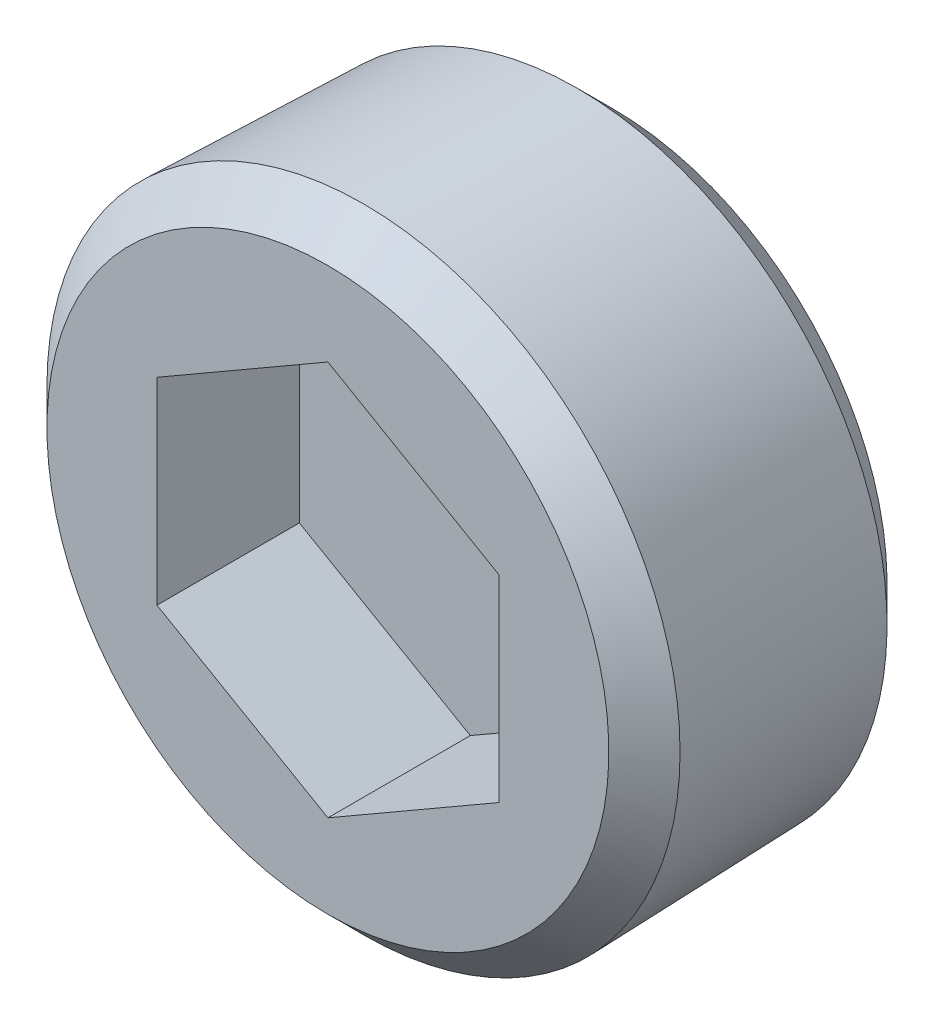
ISO-10303-21;
HEADER;
FILE_DESCRIPTION(('STEP AP214'),'2;1');
FILE_NAME('part.step','',(''),(''),'','','');
FILE_SCHEMA(('AUTOMOTIVE_DESIGN { 1 0 10303 214 1 1 1 1 }'));
ENDSEC;
DATA;
#1=APPLICATION_CONTEXT('core data for automotive mechanical design processes');
#2=APPLICATION_PROTOCOL_DEFINITION('international standard','automotive_design',2000,#1);
#3=PRODUCT_CONTEXT('',#1,'mechanical');
#4=PRODUCT('Part','Part','',(#3));
#5=PRODUCT_RELATED_PRODUCT_CATEGORY('part','',(#4));
#6=PRODUCT_DEFINITION_FORMATION('','',#4);
#7=PRODUCT_DEFINITION_CONTEXT('part definition',#1,'design');
#8=PRODUCT_DEFINITION('design','',#6,#7);
#9=PRODUCT_DEFINITION_SHAPE('','',#8);
#10=(LENGTH_UNIT() NAMED_UNIT(*) SI_UNIT(.MILLI.,.METRE.));
#11=(NAMED_UNIT(*) PLANE_ANGLE_UNIT() SI_UNIT($,.RADIAN.));
#12=(NAMED_UNIT(*) SI_UNIT($,.STERADIAN.) SOLID_ANGLE_UNIT());
#13=UNCERTAINTY_MEASURE_WITH_UNIT(LENGTH_MEASURE(1.E-05),#10,'distance_accuracy_value','');
#14=(GEOMETRIC_REPRESENTATION_CONTEXT(3) GLOBAL_UNCERTAINTY_ASSIGNED_CONTEXT((#13)) GLOBAL_UNIT_ASSIGNED_CONTEXT((#10,
#11,#12)) REPRESENTATION_CONTEXT('',''));
#15=CARTESIAN_POINT('',(0.,0.,0.));
#16=DIRECTION('',(0.,0.,1.));
#17=DIRECTION('',(1.,0.,0.));
#18=AXIS2_PLACEMENT_3D('',#15,#16,#17);
#19=CARTESIAN_POINT('',(0.,0.,0.));
#20=DIRECTION('',(0.,0.,-1.));
#21=DIRECTION('',(0.,1.,0.));
#22=AXIS2_PLACEMENT_3D('',#19,#20,#21);
#23=PLANE('',#22);
#24=CARTESIAN_POINT('',(0.,0.,0.));
#25=DIRECTION('',(0.,0.,-1.));
#26=DIRECTION('',(0.,1.,0.));
#27=AXIS2_PLACEMENT_3D('',#24,#25,#26);
#28=CIRCLE('',#27,11.5540504104122);
#29=CARTESIAN_POINT('',(0.,11.5540504104122,0.));
#30=VERTEX_POINT('',#29);
#31=EDGE_CURVE('E11',#30,#30,#28,.T.);
#32=ORIENTED_EDGE('',*,*,#31,.T.);
#33=EDGE_LOOP('',(#32));
#34=FACE_BOUND('',#33,.T.);
#35=ADVANCED_FACE('F41',(#34),#23,.T.);
#36=CARTESIAN_POINT('',(0.,0.,0.));
#37=DIRECTION('',(0.,0.,1.));
#38=DIRECTION('',(0.,-1.,0.));
#39=AXIS2_PLACEMENT_3D('',#36,#37,#38);
#40=CONICAL_SURFACE('',#39,11.5540504104122,0.785398163397446);
#41=CARTESIAN_POINT('',(0.,0.,1.5));
#42=DIRECTION('',(0.,0.,-1.));
#43=DIRECTION('',(0.,1.,0.));
#44=AXIS2_PLACEMENT_3D('',#41,#42,#43);
#45=CIRCLE('',#44,13.0540504104122);
#46=CARTESIAN_POINT('',(0.,13.0540504104122,1.5));
#47=VERTEX_POINT('',#46);
#48=EDGE_CURVE('E48',#47,#47,#45,.T.);
#49=ORIENTED_EDGE('',*,*,#48,.T.);
#50=EDGE_LOOP('',(#49));
#51=FACE_BOUND('',#50,.T.);
#52=ORIENTED_EDGE('',*,*,#31,.F.);
#53=EDGE_LOOP('',(#52));
#54=FACE_BOUND('',#53,.T.);
#55=ADVANCED_FACE('F155',(#51,#54),#40,.T.);
#56=CARTESIAN_POINT('',(0.,0.,1.5));
#57=DIRECTION('',(0.,0.,1.));
#58=DIRECTION('',(0.,-1.,0.));
#59=AXIS2_PLACEMENT_3D('',#56,#57,#58);
#60=CONICAL_SURFACE('',#59,13.0540504104122,0.0312064870256583);
#61=CARTESIAN_POINT('',(0.,0.,10.5));
#62=DIRECTION('',(0.,0.,-1.));
#63=DIRECTION('',(0.,1.,0.));
#64=AXIS2_PLACEMENT_3D('',#61,#62,#63);
#65=CIRCLE('',#64,13.335);
#66=CARTESIAN_POINT('',(0.,13.335,10.5));
#67=VERTEX_POINT('',#66);
#68=EDGE_CURVE('E150',#67,#67,#65,.T.);
#69=ORIENTED_EDGE('',*,*,#68,.T.);
#70=EDGE_LOOP('',(#69));
#71=FACE_BOUND('',#70,.T.);
#72=ORIENTED_EDGE('',*,*,#48,.F.);
#73=EDGE_LOOP('',(#72));
#74=FACE_BOUND('',#73,.T.);
#75=ADVANCED_FACE('F158',(#71,#74),#60,.T.);
#76=CARTESIAN_POINT('',(0.,0.,10.5));
#77=DIRECTION('',(0.,0.,-1.));
#78=DIRECTION('',(0.,1.,0.));
#79=AXIS2_PLACEMENT_3D('',#76,#77,#78);
#80=CONICAL_SURFACE('',#79,13.335,0.785398163397447);
#81=CARTESIAN_POINT('',(0.,0.,12.));
#82=DIRECTION('',(0.,0.,-1.));
#83=DIRECTION('',(0.,1.,0.));
#84=AXIS2_PLACEMENT_3D('',#81,#82,#83);
#85=CIRCLE('',#84,11.835);
#86=CARTESIAN_POINT('',(0.,11.835,12.));
#87=VERTEX_POINT('',#86);
#88=EDGE_CURVE('E142',#87,#87,#85,.T.);
#89=ORIENTED_EDGE('',*,*,#88,.T.);
#90=EDGE_LOOP('',(#89));
#91=FACE_BOUND('',#90,.T.);
#92=ORIENTED_EDGE('',*,*,#68,.F.);
#93=EDGE_LOOP('',(#92));
#94=FACE_BOUND('',#93,.T.);
#95=ADVANCED_FACE('F160',(#91,#94),#80,.T.);
#96=CARTESIAN_POINT('',(0.,11.835,12.));
#97=DIRECTION('',(0.,0.,1.));
#98=DIRECTION('',(0.,-1.,0.));
#99=AXIS2_PLACEMENT_3D('',#96,#97,#98);
#100=PLANE('',#99);
#101=DIRECTION('',(0.866025403784439,-0.5,0.));
#102=VECTOR('',#101,1.);
#103=CARTESIAN_POINT('',(-7.2,-4.15692193816531,12.));
#104=LINE('',#103,#102);
#105=CARTESIAN_POINT('',(-7.2,-4.15692193816531,12.));
#106=VERTEX_POINT('',#105);
#107=CARTESIAN_POINT('',(0.,-8.31384387633061,12.));
#108=VERTEX_POINT('',#107);
#109=EDGE_CURVE('E55',#106,#108,#104,.T.);
#110=ORIENTED_EDGE('',*,*,#109,.F.);
#111=DIRECTION('',(0.,-1.,0.));
#112=VECTOR('',#111,1.);
#113=CARTESIAN_POINT('',(-7.2,4.15692193816531,12.));
#114=LINE('',#113,#112);
#115=CARTESIAN_POINT('',(-7.2,4.15692193816531,12.));
#116=VERTEX_POINT('',#115);
#117=EDGE_CURVE('E138',#116,#106,#114,.T.);
#118=ORIENTED_EDGE('',*,*,#117,.F.);
#119=DIRECTION('',(-0.866025403784439,-0.5,0.));
#120=VECTOR('',#119,1.);
#121=CARTESIAN_POINT('',(0.,8.31384387633061,12.));
#122=LINE('',#121,#120);
#123=CARTESIAN_POINT('',(0.,8.31384387633061,12.));
#124=VERTEX_POINT('',#123);
#125=EDGE_CURVE('E136',#124,#116,#122,.T.);
#126=ORIENTED_EDGE('',*,*,#125,.F.);
#127=DIRECTION('',(-0.866025403784439,0.5,0.));
#128=VECTOR('',#127,1.);
#129=CARTESIAN_POINT('',(7.2,4.15692193816531,12.));
#130=LINE('',#129,#128);
#131=CARTESIAN_POINT('',(7.2,4.15692193816531,12.));
#132=VERTEX_POINT('',#131);
#133=EDGE_CURVE('E103',#132,#124,#130,.T.);
#134=ORIENTED_EDGE('',*,*,#133,.F.);
#135=DIRECTION('',(0.,1.,0.));
#136=VECTOR('',#135,1.);
#137=CARTESIAN_POINT('',(7.2,-4.15692193816531,12.));
#138=LINE('',#137,#136);
#139=CARTESIAN_POINT('',(7.2,-4.15692193816531,12.));
#140=VERTEX_POINT('',#139);
#141=EDGE_CURVE('E132',#140,#132,#138,.T.);
#142=ORIENTED_EDGE('',*,*,#141,.F.);
#143=DIRECTION('',(0.866025403784439,0.499999999999999,0.));
#144=VECTOR('',#143,1.);
#145=CARTESIAN_POINT('',(0.,-8.31384387633061,12.));
#146=LINE('',#145,#144);
#147=EDGE_CURVE('E129',#108,#140,#146,.T.);
#148=ORIENTED_EDGE('',*,*,#147,.F.);
#149=EDGE_LOOP('',(#110,#118,#126,#134,#142,#148));
#150=FACE_BOUND('',#149,.T.);
#151=ORIENTED_EDGE('',*,*,#88,.F.);
#152=EDGE_LOOP('',(#151));
#153=FACE_BOUND('',#152,.T.);
#154=ADVANCED_FACE('F166',(#150,#153),#100,.T.);
#155=CARTESIAN_POINT('',(-7.2,-4.15692193816531,6.));
#156=DIRECTION('',(-0.5,-0.866025403784439,0.));
#157=DIRECTION('',(0.866025403784439,-0.5,0.));
#158=AXIS2_PLACEMENT_3D('',#155,#156,#157);
#159=PLANE('',#158);
#160=ORIENTED_EDGE('',*,*,#109,.T.);
#161=DIRECTION('',(0.,0.,1.));
#162=VECTOR('',#161,1.);
#163=CARTESIAN_POINT('',(0.,-8.31384387633061,6.));
#164=LINE('',#163,#162);
#165=CARTESIAN_POINT('',(0.,-8.31384387633061,6.));
#166=VERTEX_POINT('',#165);
#167=EDGE_CURVE('E85',#166,#108,#164,.T.);
#168=ORIENTED_EDGE('',*,*,#167,.F.);
#169=DIRECTION('',(0.866025403784439,-0.5,0.));
#170=VECTOR('',#169,1.);
#171=CARTESIAN_POINT('',(-7.2,-4.15692193816531,6.));
#172=LINE('',#171,#170);
#173=CARTESIAN_POINT('',(-7.2,-4.15692193816531,6.));
#174=VERTEX_POINT('',#173);
#175=EDGE_CURVE('E140',#174,#166,#172,.T.);
#176=ORIENTED_EDGE('',*,*,#175,.F.);
#177=DIRECTION('',(0.,0.,1.));
#178=VECTOR('',#177,1.);
#179=CARTESIAN_POINT('',(-7.2,-4.15692193816531,6.));
#180=LINE('',#179,#178);
#181=EDGE_CURVE('E63',#174,#106,#180,.T.);
#182=ORIENTED_EDGE('',*,*,#181,.T.);
#183=EDGE_LOOP('',(#160,#168,#176,#182));
#184=FACE_BOUND('',#183,.T.);
#185=ADVANCED_FACE('F193',(#184),#159,.F.);
#186=CARTESIAN_POINT('',(-7.2,4.15692193816531,6.));
#187=DIRECTION('',(-1.,0.,0.));
#188=DIRECTION('',(0.,0.,1.));
#189=AXIS2_PLACEMENT_3D('',#186,#187,#188);
#190=PLANE('',#189);
#191=ORIENTED_EDGE('',*,*,#117,.T.);
#192=ORIENTED_EDGE('',*,*,#181,.F.);
#193=DIRECTION('',(0.,-1.,0.));
#194=VECTOR('',#193,1.);
#195=CARTESIAN_POINT('',(-7.2,4.15692193816531,6.));
#196=LINE('',#195,#194);
#197=CARTESIAN_POINT('',(-7.2,4.15692193816531,6.));
#198=VERTEX_POINT('',#197);
#199=EDGE_CURVE('E115',#198,#174,#196,.T.);
#200=ORIENTED_EDGE('',*,*,#199,.F.);
#201=DIRECTION('',(0.,0.,1.));
#202=VECTOR('',#201,1.);
#203=CARTESIAN_POINT('',(-7.2,4.15692193816531,6.));
#204=LINE('',#203,#202);
#205=EDGE_CURVE('E107',#198,#116,#204,.T.);
#206=ORIENTED_EDGE('',*,*,#205,.T.);
#207=EDGE_LOOP('',(#191,#192,#200,#206));
#208=FACE_BOUND('',#207,.T.);
#209=ADVANCED_FACE('F201',(#208),#190,.F.);
#210=CARTESIAN_POINT('',(0.,8.31384387633061,6.));
#211=DIRECTION('',(-0.5,0.866025403784439,0.));
#212=DIRECTION('',(-0.866025403784439,-0.5,0.));
#213=AXIS2_PLACEMENT_3D('',#210,#211,#212);
#214=PLANE('',#213);
#215=ORIENTED_EDGE('',*,*,#125,.T.);
#216=ORIENTED_EDGE('',*,*,#205,.F.);
#217=DIRECTION('',(-0.866025403784439,-0.5,0.));
#218=VECTOR('',#217,1.);
#219=CARTESIAN_POINT('',(0.,8.31384387633061,6.));
#220=LINE('',#219,#218);
#221=CARTESIAN_POINT('',(0.,8.31384387633061,6.));
#222=VERTEX_POINT('',#221);
#223=EDGE_CURVE('E111',#222,#198,#220,.T.);
#224=ORIENTED_EDGE('',*,*,#223,.F.);
#225=DIRECTION('',(0.,0.,1.));
#226=VECTOR('',#225,1.);
#227=CARTESIAN_POINT('',(0.,8.31384387633061,6.));
#228=LINE('',#227,#226);
#229=EDGE_CURVE('E96',#222,#124,#228,.T.);
#230=ORIENTED_EDGE('',*,*,#229,.T.);
#231=EDGE_LOOP('',(#215,#216,#224,#230));
#232=FACE_BOUND('',#231,.T.);
#233=ADVANCED_FACE('F112',(#232),#214,.F.);
#234=CARTESIAN_POINT('',(7.2,4.15692193816531,6.));
#235=DIRECTION('',(0.5,0.866025403784439,0.));
#236=DIRECTION('',(-0.866025403784439,0.5,0.));
#237=AXIS2_PLACEMENT_3D('',#234,#235,#236);
#238=PLANE('',#237);
#239=ORIENTED_EDGE('',*,*,#133,.T.);
#240=ORIENTED_EDGE('',*,*,#229,.F.);
#241=DIRECTION('',(-0.866025403784439,0.5,0.));
#242=VECTOR('',#241,1.);
#243=CARTESIAN_POINT('',(7.2,4.15692193816531,6.));
#244=LINE('',#243,#242);
#245=CARTESIAN_POINT('',(7.2,4.15692193816531,6.));
#246=VERTEX_POINT('',#245);
#247=EDGE_CURVE('E100',#246,#222,#244,.T.);
#248=ORIENTED_EDGE('',*,*,#247,.F.);
#249=DIRECTION('',(0.,0.,1.));
#250=VECTOR('',#249,1.);
#251=CARTESIAN_POINT('',(7.2,4.15692193816531,6.));
#252=LINE('',#251,#250);
#253=EDGE_CURVE('E108',#246,#132,#252,.T.);
#254=ORIENTED_EDGE('',*,*,#253,.T.);
#255=EDGE_LOOP('',(#239,#240,#248,#254));
#256=FACE_BOUND('',#255,.T.);
#257=ADVANCED_FACE('F98',(#256),#238,.F.);
#258=CARTESIAN_POINT('',(7.2,-4.15692193816531,6.));
#259=DIRECTION('',(1.,0.,0.));
#260=DIRECTION('',(0.,1.,0.));
#261=AXIS2_PLACEMENT_3D('',#258,#259,#260);
#262=PLANE('',#261);
#263=ORIENTED_EDGE('',*,*,#141,.T.);
#264=ORIENTED_EDGE('',*,*,#253,.F.);
#265=DIRECTION('',(0.,1.,0.));
#266=VECTOR('',#265,1.);
#267=CARTESIAN_POINT('',(7.2,-4.15692193816531,6.));
#268=LINE('',#267,#266);
#269=CARTESIAN_POINT('',(7.2,-4.15692193816531,6.));
#270=VERTEX_POINT('',#269);
#271=EDGE_CURVE('E121',#270,#246,#268,.T.);
#272=ORIENTED_EDGE('',*,*,#271,.F.);
#273=DIRECTION('',(0.,0.,1.));
#274=VECTOR('',#273,1.);
#275=CARTESIAN_POINT('',(7.2,-4.15692193816531,6.));
#276=LINE('',#275,#274);
#277=EDGE_CURVE('E145',#270,#140,#276,.T.);
#278=ORIENTED_EDGE('',*,*,#277,.T.);
#279=EDGE_LOOP('',(#263,#264,#272,#278));
#280=FACE_BOUND('',#279,.T.);
#281=ADVANCED_FACE('F220',(#280),#262,.F.);
#282=CARTESIAN_POINT('',(0.,-8.31384387633061,6.));
#283=DIRECTION('',(0.5,-0.866025403784439,0.));
#284=DIRECTION('',(0.866025403784439,0.5,0.));
#285=AXIS2_PLACEMENT_3D('',#282,#283,#284);
#286=PLANE('',#285);
#287=ORIENTED_EDGE('',*,*,#147,.T.);
#288=ORIENTED_EDGE('',*,*,#277,.F.);
#289=DIRECTION('',(0.866025403784439,0.499999999999999,0.));
#290=VECTOR('',#289,1.);
#291=CARTESIAN_POINT('',(0.,-8.31384387633061,6.));
#292=LINE('',#291,#290);
#293=EDGE_CURVE('E123',#166,#270,#292,.T.);
#294=ORIENTED_EDGE('',*,*,#293,.F.);
#295=ORIENTED_EDGE('',*,*,#167,.T.);
#296=EDGE_LOOP('',(#287,#288,#294,#295));
#297=FACE_BOUND('',#296,.T.);
#298=ADVANCED_FACE('F227',(#297),#286,.F.);
#299=CARTESIAN_POINT('',(-7.2,-4.15692193816531,6.));
#300=DIRECTION('',(0.,0.,-1.));
#301=DIRECTION('',(-1.,0.,0.));
#302=AXIS2_PLACEMENT_3D('',#299,#300,#301);
#303=PLANE('',#302);
#304=ORIENTED_EDGE('',*,*,#175,.T.);
#305=ORIENTED_EDGE('',*,*,#293,.T.);
#306=ORIENTED_EDGE('',*,*,#271,.T.);
#307=ORIENTED_EDGE('',*,*,#247,.T.);
#308=ORIENTED_EDGE('',*,*,#223,.T.);
#309=ORIENTED_EDGE('',*,*,#199,.T.);
#310=EDGE_LOOP('',(#304,#305,#306,#307,#308,#309));
#311=FACE_BOUND('',#310,.T.);
#312=ADVANCED_FACE('F118',(#311),#303,.F.);
#313=CLOSED_SHELL('',(#35,#55,#75,#95,#154,#185,#209,#233,#257,#281,#298,#312));
#314=MANIFOLD_SOLID_BREP('B2',#313);
#315=ADVANCED_BREP_SHAPE_REPRESENTATION('',(#18,#314),#14);
#316=SHAPE_DEFINITION_REPRESENTATION(#9,#315);
ENDSEC;
END-ISO-10303-21;
